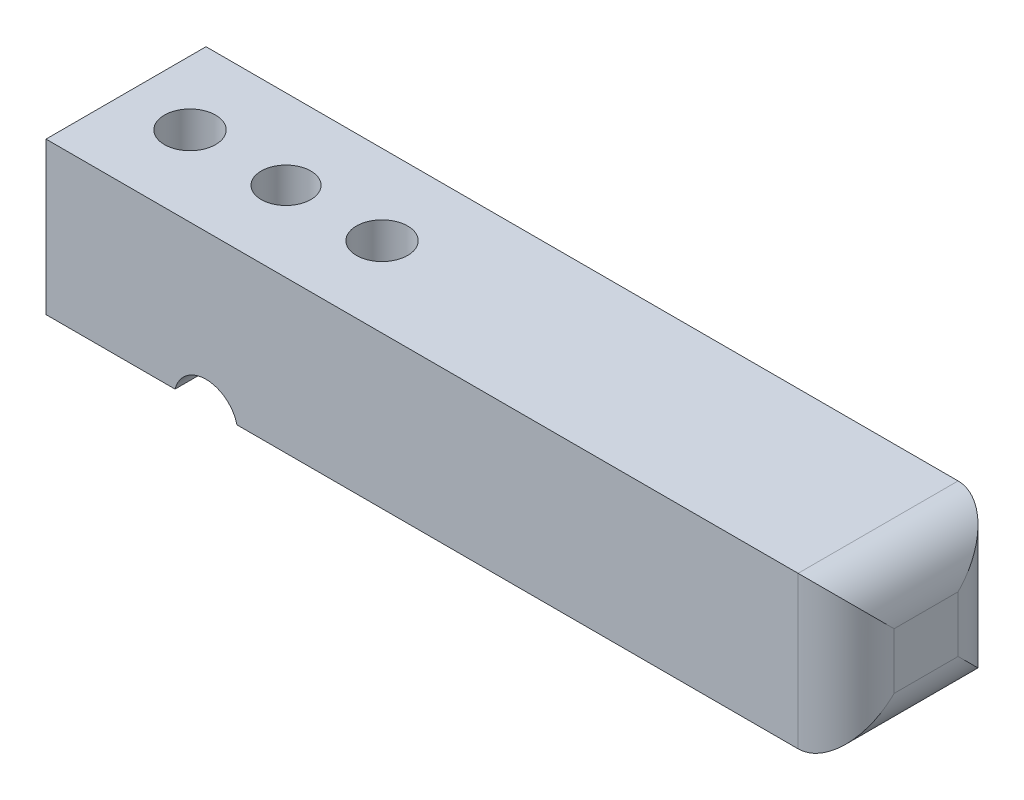
ISO-10303-21;
HEADER;
FILE_DESCRIPTION(('STEP AP214'),'2;1');
FILE_NAME('part.step','',(''),(''),'','','');
FILE_SCHEMA(('AUTOMOTIVE_DESIGN { 1 0 10303 214 1 1 1 1 }'));
ENDSEC;
DATA;
#1=APPLICATION_CONTEXT('core data for automotive mechanical design processes');
#2=APPLICATION_PROTOCOL_DEFINITION('international standard','automotive_design',2000,#1);
#3=PRODUCT_CONTEXT('',#1,'mechanical');
#4=PRODUCT('Part','Part','',(#3));
#5=PRODUCT_RELATED_PRODUCT_CATEGORY('part','',(#4));
#6=PRODUCT_DEFINITION_FORMATION('','',#4);
#7=PRODUCT_DEFINITION_CONTEXT('part definition',#1,'design');
#8=PRODUCT_DEFINITION('design','',#6,#7);
#9=PRODUCT_DEFINITION_SHAPE('','',#8);
#10=(LENGTH_UNIT() NAMED_UNIT(*) SI_UNIT(.MILLI.,.METRE.));
#11=(NAMED_UNIT(*) PLANE_ANGLE_UNIT() SI_UNIT($,.RADIAN.));
#12=(NAMED_UNIT(*) SI_UNIT($,.STERADIAN.) SOLID_ANGLE_UNIT());
#13=UNCERTAINTY_MEASURE_WITH_UNIT(LENGTH_MEASURE(1.E-05),#10,'distance_accuracy_value','');
#14=(GEOMETRIC_REPRESENTATION_CONTEXT(3) GLOBAL_UNCERTAINTY_ASSIGNED_CONTEXT((#13)) GLOBAL_UNIT_ASSIGNED_CONTEXT((#10,
#11,#12)) REPRESENTATION_CONTEXT('',''));
#15=CARTESIAN_POINT('',(0.,0.,0.));
#16=DIRECTION('',(0.,0.,1.));
#17=DIRECTION('',(1.,0.,0.));
#18=AXIS2_PLACEMENT_3D('',#15,#16,#17);
#19=CARTESIAN_POINT('',(0.,0.,10.));
#20=DIRECTION('',(0.,0.,-1.));
#21=DIRECTION('',(-1.,0.,0.));
#22=AXIS2_PLACEMENT_3D('',#19,#20,#21);
#23=CYLINDRICAL_SURFACE('',#22,2.);
#24=CARTESIAN_POINT('',(0.,2.,6.55));
#25=CARTESIAN_POINT('',(-0.0751536759924737,1.99999779760413,6.54999772768202));
#26=CARTESIAN_POINT('',(-0.150323982873093,1.99572691679677,6.54449810988736));
#27=CARTESIAN_POINT('',(-0.298199992054018,1.97904682033873,6.52288289983196));
#28=CARTESIAN_POINT('',(-0.37090395520125,1.96663198244478,6.50675997365466));
#29=CARTESIAN_POINT('',(-0.511418392934419,1.93484304159992,6.46502524295048));
#30=CARTESIAN_POINT('',(-0.579253451770658,1.91550736385041,6.43946580668986));
#31=CARTESIAN_POINT('',(-0.709202279732247,1.87129627902476,6.38008767384917));
#32=CARTESIAN_POINT('',(-0.771315363997565,1.84642021003683,6.34626799036881));
#33=CARTESIAN_POINT('',(-0.894694694530713,1.79012312670498,6.2680109041479));
#34=CARTESIAN_POINT('',(-0.955333341339268,1.75830681708261,6.22287455059775));
#35=CARTESIAN_POINT('',(-1.06865285187097,1.69183519595819,6.12520549732533));
#36=CARTESIAN_POINT('',(-1.12132238113412,1.65717594693956,6.07266246436559));
#37=CARTESIAN_POINT('',(-1.22897464440383,1.57953035369098,5.9488137658501));
#38=CARTESIAN_POINT('',(-1.2819930968487,1.536364561375,5.87590809165899));
#39=CARTESIAN_POINT('',(-1.37530471143981,1.45341275637492,5.7205781676354));
#40=CARTESIAN_POINT('',(-1.41561199089066,1.41362303032866,5.6381646174446));
#41=CARTESIAN_POINT('',(-1.47002795066326,1.35646033886457,5.49506494351921));
#42=CARTESIAN_POINT('',(-1.4883496130572,1.33616218096837,5.43716529019969));
#43=CARTESIAN_POINT('',(-1.51829517244874,1.30203552282385,5.31787589419606));
#44=CARTESIAN_POINT('',(-1.52993481059462,1.28819183207953,5.25649473136072));
#45=CARTESIAN_POINT('',(-1.54579323144967,1.26913046385795,5.13067086685359));
#46=CARTESIAN_POINT('',(-1.54992818718431,1.26401026565661,5.06620174014896));
#47=CARTESIAN_POINT('',(-1.55006990673508,1.26383700378979,4.93723596769177));
#48=CARTESIAN_POINT('',(-1.54607696275994,1.26878357821053,4.87273932301186));
#49=CARTESIAN_POINT('',(-1.53143160977061,1.28639696773229,4.7544259513841));
#50=CARTESIAN_POINT('',(-1.52171754907049,1.2979705438194,4.70031491943259));
#51=CARTESIAN_POINT('',(-1.49705955803457,1.32633598937714,4.59471360313749));
#52=CARTESIAN_POINT('',(-1.48210966620696,1.34313380468937,4.54322638312653));
#53=CARTESIAN_POINT('',(-1.43607426452343,1.39264188426146,4.41014157813249));
#54=CARTESIAN_POINT('',(-1.40085730908349,1.42852701365433,4.33116066139441));
#55=CARTESIAN_POINT('',(-1.31902100653082,1.50443429746572,4.18147184927585));
#56=CARTESIAN_POINT('',(-1.27237233814997,1.54446693497177,4.11078593042027));
#57=CARTESIAN_POINT('',(-1.16645539782076,1.62604170063465,3.97554547918557));
#58=CARTESIAN_POINT('',(-1.10680059862561,1.66758734444557,3.91129449324396));
#59=CARTESIAN_POINT('',(-0.97629957466434,1.74718844745096,3.79290635738495));
#60=CARTESIAN_POINT('',(-0.905473054362069,1.78524986868359,3.73875175986926));
#61=CARTESIAN_POINT('',(-0.766482875320224,1.84858773708474,3.65072856706321));
#62=CARTESIAN_POINT('',(-0.700012687883923,1.87493614938455,3.61496899421064));
#63=CARTESIAN_POINT('',(-0.560661412610429,1.92120673848397,3.55294682204902));
#64=CARTESIAN_POINT('',(-0.487783769237814,1.94113234144231,3.5266791585042));
#65=CARTESIAN_POINT('',(-0.336657866167162,1.97298265324959,3.48496072083245));
#66=CARTESIAN_POINT('',(-0.258373950104772,1.98484724870172,3.46959118109689));
#67=CARTESIAN_POINT('',(-0.0995316901465832,1.99910852116207,3.45113884490945));
#68=CARTESIAN_POINT('',(-0.0189749895806388,2.00151187091737,3.4480473890611));
#69=CARTESIAN_POINT('',(0.131583195738159,1.99691400584956,3.45398387133413));
#70=CARTESIAN_POINT('',(0.201681791904024,1.99101618619423,3.46158981244569));
#71=CARTESIAN_POINT('',(0.339284633951676,1.97223441483079,3.48597585961044));
#72=CARTESIAN_POINT('',(0.406788484270212,1.95934940242841,3.50275735856695));
#73=CARTESIAN_POINT('',(0.538365709859793,1.9273824183246,3.54483950777805));
#74=CARTESIAN_POINT('',(0.602392333539377,1.90823282130966,3.57023324096011));
#75=CARTESIAN_POINT('',(0.725171141364102,1.86503833542068,3.62841436737424));
#76=CARTESIAN_POINT('',(0.783922394155309,1.84099258458162,3.6612030625946));
#77=CARTESIAN_POINT('',(0.90447332466438,1.7852195772799,3.73890618520717));
#78=CARTESIAN_POINT('',(0.965277744575326,1.7528788767945,3.7849190889227));
#79=CARTESIAN_POINT('',(1.07876951358238,1.68541588021489,3.88444347940041));
#80=CARTESIAN_POINT('',(1.13144295625954,1.65028897080648,3.93796752050158));
#81=CARTESIAN_POINT('',(1.23861256374313,1.57197605255609,4.06376076259703));
#82=CARTESIAN_POINT('',(1.29116318642109,1.52864851644377,4.13760503756645));
#83=CARTESIAN_POINT('',(1.38333956093251,1.44574808149131,4.2949017126505));
#84=CARTESIAN_POINT('',(1.42298360038617,1.406169926986,4.37834028938247));
#85=CARTESIAN_POINT('',(1.47572537412509,1.35023532687271,4.52225188434806));
#86=CARTESIAN_POINT('',(1.49322213447881,1.33069594137269,4.57985835002319));
#87=CARTESIAN_POINT('',(1.52159153089938,1.29816285204411,4.69840858194056));
#88=CARTESIAN_POINT('',(1.53247993279712,1.28515358199035,4.75934402413404));
#89=CARTESIAN_POINT('',(1.54693721545875,1.26772524363723,4.88401864047516));
#90=CARTESIAN_POINT('',(1.55042885491277,1.26339685076968,4.94778037056076));
#91=CARTESIAN_POINT('',(1.54948622342283,1.26455222048878,5.07516537278516));
#92=CARTESIAN_POINT('',(1.54505060737967,1.27003764828777,5.138788619592));
#93=CARTESIAN_POINT('',(1.52970948772263,1.28844944320309,5.25605818319737));
#94=CARTESIAN_POINT('',(1.51964899950482,1.30039837928582,5.30998219183345));
#95=CARTESIAN_POINT('',(1.49434336712751,1.32940199648196,5.41517297762657));
#96=CARTESIAN_POINT('',(1.47909268933357,1.34646212467208,5.46643685111277));
#97=CARTESIAN_POINT('',(1.43204231479972,1.39681685136009,5.59966808638332));
#98=CARTESIAN_POINT('',(1.39602704839096,1.43328590207102,5.67894216496683));
#99=CARTESIAN_POINT('',(1.31244857045295,1.51020860863294,5.82908963861255));
#100=CARTESIAN_POINT('',(1.26485525650726,1.55067248520946,5.89994040673449));
#101=CARTESIAN_POINT('',(1.15692383769273,1.63287765781587,6.03525821974403));
#102=CARTESIAN_POINT('',(1.0962088679167,1.67461583203533,6.09942800819506));
#103=CARTESIAN_POINT('',(0.963444579945199,1.75435306725546,6.21742929196242));
#104=CARTESIAN_POINT('',(0.891415359723607,1.79235856781501,6.2712787501435));
#105=CARTESIAN_POINT('',(0.751025417422994,1.85491898331156,6.35791780499437));
#106=CARTESIAN_POINT('',(0.684467194211778,1.88066107606843,6.39276123986329));
#107=CARTESIAN_POINT('',(0.545140978222765,1.92565785300357,6.45294847541834));
#108=CARTESIAN_POINT('',(0.472380255459936,1.94492000482929,6.47830321493365));
#109=CARTESIAN_POINT('',(0.333400615652659,1.97309528922267,6.51516434047281));
#110=CARTESIAN_POINT('',(0.267803188477444,1.98311689281876,6.52816318516231));
#111=CARTESIAN_POINT('',(0.134808049666178,1.99656955117628,6.54558114257173));
#112=CARTESIAN_POINT('',(0.0674107150909819,2.00000197548661,6.55000203820476));
#113=CARTESIAN_POINT('',(0.,2.,6.55));
#114=B_SPLINE_CURVE_WITH_KNOTS('',3,(#24,#25,#26,#27,#28,#29,#30,#31,#32,#33,#34,#35,#36,#37,
#38,#39,#40,#41,#42,#43,#44,#45,#46,#47,#48,#49,#50,#51,#52,#53,#54,#55,#56,#57,#58,#59,#60,#61,
#62,#63,#64,#65,#66,#67,#68,#69,#70,#71,#72,#73,#74,#75,#76,#77,#78,#79,#80,#81,#82,#83,#84,#85,
#86,#87,#88,#89,#90,#91,#92,#93,#94,#95,#96,#97,#98,#99,#100,#101,#102,#103,#104,#105,#106,#107,
#108,#109,#110,#111,#112,#113),.UNSPECIFIED.,.T.,.F.,(4,2,2,2,2,2,2,2,2,2,2,2,2,2,2,2,2,2,2,2,2,
2,2,2,2,2,2,2,2,2,2,2,2,2,2,2,2,2,2,2,2,2,2,2,4),(0.,0.225181883608359,0.450519387090874,
0.674624721330886,0.89875684386133,1.14394244625269,1.38947356217851,1.68811842511844,
1.98643042885487,2.17792722300026,2.36897102844473,2.56213595150375,2.75529393015126,
2.92321250987939,3.09132290580978,3.37065947238806,3.65072015086896,3.94064246840192,
4.23005902978722,4.46895330734628,4.70771993835557,4.94824813637955,5.18860666629334,
5.39986464292888,5.61115469866806,5.82480532655742,6.03849360008622,6.28608532454966,
6.53409592245848,6.83425485575362,7.13398661729953,7.32327462496874,7.51210924690463,
7.7029062624513,7.89373565556959,8.06154510761747,8.22953403682791,8.51118123353462,
8.79356867722865,9.08551455704617,9.37694758671337,9.61426342125323,9.85130482257881,
10.0533285780904,10.2553103387843),.UNSPECIFIED.);
#115=CARTESIAN_POINT('',(0.,2.,6.55));
#116=VERTEX_POINT('',#115);
#117=EDGE_CURVE('E188',#116,#116,#114,.T.);
#118=ORIENTED_EDGE('',*,*,#117,.F.);
#119=EDGE_LOOP('',(#118));
#120=FACE_BOUND('',#119,.T.);
#121=CARTESIAN_POINT('',(0.,0.,0.));
#122=DIRECTION('',(0.,0.,1.));
#123=DIRECTION('',(1.,0.,0.));
#124=AXIS2_PLACEMENT_3D('',#121,#122,#123);
#125=CIRCLE('',#124,2.);
#126=CARTESIAN_POINT('',(1.93649167310371,0.5,0.));
#127=VERTEX_POINT('',#126);
#128=CARTESIAN_POINT('',(-1.93649167310371,0.5,0.));
#129=VERTEX_POINT('',#128);
#130=EDGE_CURVE('E113',#127,#129,#125,.T.);
#131=ORIENTED_EDGE('',*,*,#130,.F.);
#132=DIRECTION('',(0.,0.,-1.));
#133=VECTOR('',#132,1.);
#134=CARTESIAN_POINT('',(1.93649167310371,0.5,10.));
#135=LINE('',#134,#133);
#136=CARTESIAN_POINT('',(1.93649167310371,0.5,10.));
#137=VERTEX_POINT('',#136);
#138=EDGE_CURVE('E108',#137,#127,#135,.T.);
#139=ORIENTED_EDGE('',*,*,#138,.F.);
#140=CARTESIAN_POINT('',(0.,0.,10.));
#141=DIRECTION('',(0.,0.,1.));
#142=DIRECTION('',(1.,0.,0.));
#143=AXIS2_PLACEMENT_3D('',#140,#141,#142);
#144=CIRCLE('',#143,2.);
#145=CARTESIAN_POINT('',(-1.93649167310371,0.5,10.));
#146=VERTEX_POINT('',#145);
#147=EDGE_CURVE('E111',#137,#146,#144,.T.);
#148=ORIENTED_EDGE('',*,*,#147,.T.);
#149=DIRECTION('',(0.,0.,-1.));
#150=VECTOR('',#149,1.);
#151=CARTESIAN_POINT('',(-1.93649167310371,0.5,10.));
#152=LINE('',#151,#150);
#153=EDGE_CURVE('E146',#146,#129,#152,.T.);
#154=ORIENTED_EDGE('',*,*,#153,.T.);
#155=EDGE_LOOP('',(#131,#139,#148,#154));
#156=FACE_BOUND('',#155,.T.);
#157=ADVANCED_FACE('F40',(#120,#156),#23,.F.);
#158=CARTESIAN_POINT('',(0.,0.5,10.));
#159=DIRECTION('',(0.,1.,0.));
#160=DIRECTION('',(0.,0.,1.));
#161=AXIS2_PLACEMENT_3D('',#158,#159,#160);
#162=PLANE('',#161);
#163=CARTESIAN_POINT('',(6.,0.5,5.));
#164=DIRECTION('',(0.,1.,0.));
#165=DIRECTION('',(0.,0.,1.));
#166=AXIS2_PLACEMENT_3D('',#163,#164,#165);
#167=CIRCLE('',#166,1.6);
#168=CARTESIAN_POINT('',(6.,0.5,6.6));
#169=VERTEX_POINT('',#168);
#170=EDGE_CURVE('E138',#169,#169,#167,.T.);
#171=ORIENTED_EDGE('',*,*,#170,.T.);
#172=EDGE_LOOP('',(#171));
#173=FACE_BOUND('',#172,.T.);
#174=DIRECTION('',(1.,0.,0.));
#175=VECTOR('',#174,1.);
#176=CARTESIAN_POINT('',(0.,0.5,0.));
#177=LINE('',#176,#175);
#178=CARTESIAN_POINT('',(37.,0.5,0.));
#179=VERTEX_POINT('',#178);
#180=EDGE_CURVE('E148',#127,#179,#177,.T.);
#181=ORIENTED_EDGE('',*,*,#180,.T.);
#182=DIRECTION('',(0.,0.,-1.));
#183=VECTOR('',#182,1.);
#184=CARTESIAN_POINT('',(37.,0.5,10.));
#185=LINE('',#184,#183);
#186=CARTESIAN_POINT('',(37.,0.5,10.));
#187=VERTEX_POINT('',#186);
#188=EDGE_CURVE('E11',#179,#187,#185,.F.);
#189=ORIENTED_EDGE('',*,*,#188,.T.);
#190=DIRECTION('',(1.,0.,0.));
#191=VECTOR('',#190,1.);
#192=CARTESIAN_POINT('',(0.,0.5,10.));
#193=LINE('',#192,#191);
#194=EDGE_CURVE('E119',#137,#187,#193,.T.);
#195=ORIENTED_EDGE('',*,*,#194,.F.);
#196=ORIENTED_EDGE('',*,*,#138,.T.);
#197=EDGE_LOOP('',(#181,#189,#195,#196));
#198=FACE_BOUND('',#197,.T.);
#199=ADVANCED_FACE('F120',(#173,#198),#162,.F.);
#200=CARTESIAN_POINT('',(0.,10.,10.));
#201=DIRECTION('',(0.,1.,0.));
#202=DIRECTION('',(0.,0.,1.));
#203=AXIS2_PLACEMENT_3D('',#200,#201,#202);
#204=PLANE('',#203);
#205=CARTESIAN_POINT('',(0.,10.,5.));
#206=DIRECTION('',(0.,1.,0.));
#207=DIRECTION('',(0.,0.,1.));
#208=AXIS2_PLACEMENT_3D('',#205,#206,#207);
#209=CIRCLE('',#208,1.55);
#210=CARTESIAN_POINT('',(0.,10.,6.55));
#211=VERTEX_POINT('',#210);
#212=EDGE_CURVE('E183',#211,#211,#209,.T.);
#213=ORIENTED_EDGE('',*,*,#212,.F.);
#214=EDGE_LOOP('',(#213));
#215=FACE_BOUND('',#214,.T.);
#216=CARTESIAN_POINT('',(-6.,10.,5.));
#217=DIRECTION('',(0.,1.,0.));
#218=DIRECTION('',(0.,0.,1.));
#219=AXIS2_PLACEMENT_3D('',#216,#217,#218);
#220=CIRCLE('',#219,1.6);
#221=CARTESIAN_POINT('',(-6.,10.,6.6));
#222=VERTEX_POINT('',#221);
#223=EDGE_CURVE('E161',#222,#222,#220,.T.);
#224=ORIENTED_EDGE('',*,*,#223,.F.);
#225=EDGE_LOOP('',(#224));
#226=FACE_BOUND('',#225,.T.);
#227=CARTESIAN_POINT('',(6.,10.,5.));
#228=DIRECTION('',(0.,1.,0.));
#229=DIRECTION('',(0.,0.,1.));
#230=AXIS2_PLACEMENT_3D('',#227,#228,#229);
#231=CIRCLE('',#230,1.6);
#232=CARTESIAN_POINT('',(6.,10.,6.6));
#233=VERTEX_POINT('',#232);
#234=EDGE_CURVE('E193',#233,#233,#231,.T.);
#235=ORIENTED_EDGE('',*,*,#234,.F.);
#236=EDGE_LOOP('',(#235));
#237=FACE_BOUND('',#236,.T.);
#238=DIRECTION('',(1.,0.,0.));
#239=VECTOR('',#238,1.);
#240=CARTESIAN_POINT('',(0.,10.,10.));
#241=LINE('',#240,#239);
#242=CARTESIAN_POINT('',(-10.,10.,10.));
#243=VERTEX_POINT('',#242);
#244=CARTESIAN_POINT('',(37.,10.,10.));
#245=VERTEX_POINT('',#244);
#246=EDGE_CURVE('E125',#243,#245,#241,.T.);
#247=ORIENTED_EDGE('',*,*,#246,.T.);
#248=DIRECTION('',(0.,0.,1.));
#249=VECTOR('',#248,1.);
#250=CARTESIAN_POINT('',(37.,10.,10.));
#251=LINE('',#250,#249);
#252=CARTESIAN_POINT('',(37.,10.,0.));
#253=VERTEX_POINT('',#252);
#254=EDGE_CURVE('E64',#245,#253,#251,.F.);
#255=ORIENTED_EDGE('',*,*,#254,.T.);
#256=DIRECTION('',(1.,0.,0.));
#257=VECTOR('',#256,1.);
#258=CARTESIAN_POINT('',(0.,10.,0.));
#259=LINE('',#258,#257);
#260=CARTESIAN_POINT('',(-10.,10.,0.));
#261=VERTEX_POINT('',#260);
#262=EDGE_CURVE('E150',#261,#253,#259,.T.);
#263=ORIENTED_EDGE('',*,*,#262,.F.);
#264=DIRECTION('',(0.,0.,-1.));
#265=VECTOR('',#264,1.);
#266=CARTESIAN_POINT('',(-10.,10.,10.));
#267=LINE('',#266,#265);
#268=EDGE_CURVE('E116',#243,#261,#267,.T.);
#269=ORIENTED_EDGE('',*,*,#268,.F.);
#270=EDGE_LOOP('',(#247,#255,#263,#269));
#271=FACE_BOUND('',#270,.T.);
#272=ADVANCED_FACE('F231',(#215,#226,#237,#271),#204,.T.);
#273=CARTESIAN_POINT('',(-10.,0.,10.));
#274=DIRECTION('',(-1.,0.,0.));
#275=DIRECTION('',(0.,0.,1.));
#276=AXIS2_PLACEMENT_3D('',#273,#274,#275);
#277=PLANE('',#276);
#278=DIRECTION('',(0.,1.,0.));
#279=VECTOR('',#278,1.);
#280=CARTESIAN_POINT('',(-10.,0.,0.));
#281=LINE('',#280,#279);
#282=CARTESIAN_POINT('',(-10.,0.5,0.));
#283=VERTEX_POINT('',#282);
#284=EDGE_CURVE('E135',#283,#261,#281,.T.);
#285=ORIENTED_EDGE('',*,*,#284,.F.);
#286=DIRECTION('',(0.,0.,-1.));
#287=VECTOR('',#286,1.);
#288=CARTESIAN_POINT('',(-10.,0.5,10.));
#289=LINE('',#288,#287);
#290=CARTESIAN_POINT('',(-10.,0.5,10.));
#291=VERTEX_POINT('',#290);
#292=EDGE_CURVE('E155',#291,#283,#289,.T.);
#293=ORIENTED_EDGE('',*,*,#292,.F.);
#294=DIRECTION('',(0.,1.,0.));
#295=VECTOR('',#294,1.);
#296=CARTESIAN_POINT('',(-10.,0.,10.));
#297=LINE('',#296,#295);
#298=EDGE_CURVE('E142',#291,#243,#297,.T.);
#299=ORIENTED_EDGE('',*,*,#298,.T.);
#300=ORIENTED_EDGE('',*,*,#268,.T.);
#301=EDGE_LOOP('',(#285,#293,#299,#300));
#302=FACE_BOUND('',#301,.T.);
#303=ADVANCED_FACE('F227',(#302),#277,.T.);
#304=CARTESIAN_POINT('',(0.,0.5,10.));
#305=DIRECTION('',(0.,1.,0.));
#306=DIRECTION('',(0.,0.,1.));
#307=AXIS2_PLACEMENT_3D('',#304,#305,#306);
#308=PLANE('',#307);
#309=CARTESIAN_POINT('',(-6.,0.5,5.));
#310=DIRECTION('',(0.,1.,0.));
#311=DIRECTION('',(0.,0.,1.));
#312=AXIS2_PLACEMENT_3D('',#309,#310,#311);
#313=CIRCLE('',#312,1.6);
#314=CARTESIAN_POINT('',(-6.,0.5,6.6));
#315=VERTEX_POINT('',#314);
#316=EDGE_CURVE('E158',#315,#315,#313,.T.);
#317=ORIENTED_EDGE('',*,*,#316,.T.);
#318=EDGE_LOOP('',(#317));
#319=FACE_BOUND('',#318,.T.);
#320=DIRECTION('',(1.,0.,0.));
#321=VECTOR('',#320,1.);
#322=CARTESIAN_POINT('',(0.,0.5,0.));
#323=LINE('',#322,#321);
#324=EDGE_CURVE('E132',#283,#129,#323,.T.);
#325=ORIENTED_EDGE('',*,*,#324,.T.);
#326=ORIENTED_EDGE('',*,*,#153,.F.);
#327=DIRECTION('',(1.,0.,0.));
#328=VECTOR('',#327,1.);
#329=CARTESIAN_POINT('',(0.,0.5,10.));
#330=LINE('',#329,#328);
#331=EDGE_CURVE('E130',#291,#146,#330,.T.);
#332=ORIENTED_EDGE('',*,*,#331,.F.);
#333=ORIENTED_EDGE('',*,*,#292,.T.);
#334=EDGE_LOOP('',(#325,#326,#332,#333));
#335=FACE_BOUND('',#334,.T.);
#336=ADVANCED_FACE('F222',(#319,#335),#308,.F.);
#337=CARTESIAN_POINT('',(0.,0.,10.));
#338=DIRECTION('',(0.,0.,1.));
#339=DIRECTION('',(1.,0.,0.));
#340=AXIS2_PLACEMENT_3D('',#337,#338,#339);
#341=PLANE('',#340);
#342=ORIENTED_EDGE('',*,*,#194,.T.);
#343=DIRECTION('',(0.,-1.,0.));
#344=VECTOR('',#343,1.);
#345=CARTESIAN_POINT('',(37.,0.,10.));
#346=LINE('',#345,#344);
#347=EDGE_CURVE('E170',#187,#245,#346,.F.);
#348=ORIENTED_EDGE('',*,*,#347,.T.);
#349=ORIENTED_EDGE('',*,*,#246,.F.);
#350=ORIENTED_EDGE('',*,*,#298,.F.);
#351=ORIENTED_EDGE('',*,*,#331,.T.);
#352=ORIENTED_EDGE('',*,*,#147,.F.);
#353=EDGE_LOOP('',(#342,#348,#349,#350,#351,#352));
#354=FACE_BOUND('',#353,.T.);
#355=ADVANCED_FACE('F127',(#354),#341,.T.);
#356=CARTESIAN_POINT('',(0.,0.,0.));
#357=DIRECTION('',(0.,0.,1.));
#358=DIRECTION('',(1.,0.,0.));
#359=AXIS2_PLACEMENT_3D('',#356,#357,#358);
#360=PLANE('',#359);
#361=ORIENTED_EDGE('',*,*,#262,.T.);
#362=DIRECTION('',(0.,1.,0.));
#363=VECTOR('',#362,1.);
#364=CARTESIAN_POINT('',(37.,0.499999999999997,0.));
#365=LINE('',#364,#363);
#366=EDGE_CURVE('E49',#253,#179,#365,.F.);
#367=ORIENTED_EDGE('',*,*,#366,.T.);
#368=ORIENTED_EDGE('',*,*,#180,.F.);
#369=ORIENTED_EDGE('',*,*,#130,.T.);
#370=ORIENTED_EDGE('',*,*,#324,.F.);
#371=ORIENTED_EDGE('',*,*,#284,.T.);
#372=EDGE_LOOP('',(#361,#367,#368,#369,#370,#371));
#373=FACE_BOUND('',#372,.T.);
#374=ADVANCED_FACE('F215',(#373),#360,.F.);
#375=CARTESIAN_POINT('',(-6.,-10.,5.));
#376=DIRECTION('',(0.,1.,0.));
#377=DIRECTION('',(0.,0.,1.));
#378=AXIS2_PLACEMENT_3D('',#375,#376,#377);
#379=CYLINDRICAL_SURFACE('',#378,1.6);
#380=ORIENTED_EDGE('',*,*,#223,.T.);
#381=EDGE_LOOP('',(#380));
#382=FACE_BOUND('',#381,.T.);
#383=ORIENTED_EDGE('',*,*,#316,.F.);
#384=EDGE_LOOP('',(#383));
#385=FACE_BOUND('',#384,.T.);
#386=ADVANCED_FACE('F212',(#382,#385),#379,.F.);
#387=CARTESIAN_POINT('',(6.,-10.,5.));
#388=DIRECTION('',(0.,1.,0.));
#389=DIRECTION('',(0.,0.,1.));
#390=AXIS2_PLACEMENT_3D('',#387,#388,#389);
#391=CYLINDRICAL_SURFACE('',#390,1.6);
#392=ORIENTED_EDGE('',*,*,#234,.T.);
#393=EDGE_LOOP('',(#392));
#394=FACE_BOUND('',#393,.T.);
#395=ORIENTED_EDGE('',*,*,#170,.F.);
#396=EDGE_LOOP('',(#395));
#397=FACE_BOUND('',#396,.T.);
#398=ADVANCED_FACE('F210',(#394,#397),#391,.F.);
#399=CARTESIAN_POINT('',(0.,0.,5.));
#400=DIRECTION('',(0.,1.,0.));
#401=DIRECTION('',(0.,0.,1.));
#402=AXIS2_PLACEMENT_3D('',#399,#400,#401);
#403=CYLINDRICAL_SURFACE('',#402,1.55);
#404=ORIENTED_EDGE('',*,*,#117,.T.);
#405=EDGE_LOOP('',(#404));
#406=FACE_BOUND('',#405,.T.);
#407=ORIENTED_EDGE('',*,*,#212,.T.);
#408=EDGE_LOOP('',(#407));
#409=FACE_BOUND('',#408,.T.);
#410=ADVANCED_FACE('F204',(#406,#409),#403,.F.);
#411=CARTESIAN_POINT('',(40.,0.,0.));
#412=DIRECTION('',(1.,0.,0.));
#413=DIRECTION('',(0.,0.,-1.));
#414=AXIS2_PLACEMENT_3D('',#411,#412,#413);
#415=PLANE('',#414);
#416=DIRECTION('',(0.,0.,1.));
#417=VECTOR('',#416,1.);
#418=CARTESIAN_POINT('',(40.,7.,0.));
#419=LINE('',#418,#417);
#420=CARTESIAN_POINT('',(40.,7.,3.));
#421=VERTEX_POINT('',#420);
#422=CARTESIAN_POINT('',(40.,7.,7.));
#423=VERTEX_POINT('',#422);
#424=EDGE_CURVE('E165',#421,#423,#419,.T.);
#425=ORIENTED_EDGE('',*,*,#424,.T.);
#426=DIRECTION('',(0.,-1.,0.));
#427=VECTOR('',#426,1.);
#428=CARTESIAN_POINT('',(40.,0.,7.));
#429=LINE('',#428,#427);
#430=CARTESIAN_POINT('',(40.,3.5,7.));
#431=VERTEX_POINT('',#430);
#432=EDGE_CURVE('E167',#423,#431,#429,.T.);
#433=ORIENTED_EDGE('',*,*,#432,.T.);
#434=DIRECTION('',(0.,0.,-1.));
#435=VECTOR('',#434,1.);
#436=CARTESIAN_POINT('',(40.,3.5,0.));
#437=LINE('',#436,#435);
#438=CARTESIAN_POINT('',(40.,3.5,3.));
#439=VERTEX_POINT('',#438);
#440=EDGE_CURVE('E115',#431,#439,#437,.T.);
#441=ORIENTED_EDGE('',*,*,#440,.T.);
#442=DIRECTION('',(0.,1.,0.));
#443=VECTOR('',#442,1.);
#444=CARTESIAN_POINT('',(40.,10.,3.));
#445=LINE('',#444,#443);
#446=EDGE_CURVE('E163',#439,#421,#445,.T.);
#447=ORIENTED_EDGE('',*,*,#446,.T.);
#448=EDGE_LOOP('',(#425,#433,#441,#447));
#449=FACE_BOUND('',#448,.T.);
#450=ADVANCED_FACE('F209',(#449),#415,.T.);
#451=CARTESIAN_POINT('',(37.,0.,3.));
#452=DIRECTION('',(0.,-1.,0.));
#453=DIRECTION('',(0.,0.,-1.));
#454=AXIS2_PLACEMENT_3D('',#451,#452,#453);
#455=CYLINDRICAL_SURFACE('',#454,3.);
#456=CARTESIAN_POINT('',(37.,3.5,3.));
#457=DIRECTION('',(0.,-0.707106781186547,0.707106781186547));
#458=DIRECTION('',(0.,0.707106781186547,0.707106781186547));
#459=AXIS2_PLACEMENT_3D('',#456,#457,#458);
#460=ELLIPSE('',#459,4.24264068711928,3.);
#461=EDGE_CURVE('E177',#179,#439,#460,.T.);
#462=ORIENTED_EDGE('',*,*,#461,.F.);
#463=ORIENTED_EDGE('',*,*,#366,.F.);
#464=CARTESIAN_POINT('',(37.,7.,3.));
#465=DIRECTION('',(0.,-0.707106781186547,-0.707106781186547));
#466=DIRECTION('',(0.,-0.707106781186547,0.707106781186547));
#467=AXIS2_PLACEMENT_3D('',#464,#465,#466);
#468=ELLIPSE('',#467,4.24264068711928,3.);
#469=EDGE_CURVE('E44',#421,#253,#468,.F.);
#470=ORIENTED_EDGE('',*,*,#469,.F.);
#471=ORIENTED_EDGE('',*,*,#446,.F.);
#472=EDGE_LOOP('',(#462,#463,#470,#471));
#473=FACE_BOUND('',#472,.T.);
#474=ADVANCED_FACE('F42',(#473),#455,.T.);
#475=CARTESIAN_POINT('',(37.,7.,0.));
#476=DIRECTION('',(0.,0.,1.));
#477=DIRECTION('',(1.,0.,0.));
#478=AXIS2_PLACEMENT_3D('',#475,#476,#477);
#479=CYLINDRICAL_SURFACE('',#478,3.);
#480=ORIENTED_EDGE('',*,*,#469,.T.);
#481=ORIENTED_EDGE('',*,*,#254,.F.);
#482=CARTESIAN_POINT('',(37.,7.,7.));
#483=DIRECTION('',(0.,-0.707106781186547,0.707106781186547));
#484=DIRECTION('',(0.,0.707106781186547,0.707106781186547));
#485=AXIS2_PLACEMENT_3D('',#482,#483,#484);
#486=ELLIPSE('',#485,4.24264068711928,3.);
#487=EDGE_CURVE('E176',#423,#245,#486,.T.);
#488=ORIENTED_EDGE('',*,*,#487,.F.);
#489=ORIENTED_EDGE('',*,*,#424,.F.);
#490=EDGE_LOOP('',(#480,#481,#488,#489));
#491=FACE_BOUND('',#490,.T.);
#492=ADVANCED_FACE('F329',(#491),#479,.T.);
#493=CARTESIAN_POINT('',(37.,3.5,0.));
#494=DIRECTION('',(0.,0.,1.));
#495=DIRECTION('',(1.,0.,0.));
#496=AXIS2_PLACEMENT_3D('',#493,#494,#495);
#497=CYLINDRICAL_SURFACE('',#496,3.);
#498=ORIENTED_EDGE('',*,*,#461,.T.);
#499=ORIENTED_EDGE('',*,*,#440,.F.);
#500=CARTESIAN_POINT('',(37.,3.5,7.));
#501=DIRECTION('',(0.,0.707106781186547,0.707106781186547));
#502=DIRECTION('',(0.,-0.707106781186547,0.707106781186547));
#503=AXIS2_PLACEMENT_3D('',#500,#501,#502);
#504=ELLIPSE('',#503,4.24264068711928,3.);
#505=EDGE_CURVE('E174',#187,#431,#504,.T.);
#506=ORIENTED_EDGE('',*,*,#505,.F.);
#507=ORIENTED_EDGE('',*,*,#188,.F.);
#508=EDGE_LOOP('',(#498,#499,#506,#507));
#509=FACE_BOUND('',#508,.T.);
#510=ADVANCED_FACE('F338',(#509),#497,.T.);
#511=CARTESIAN_POINT('',(37.,0.,7.));
#512=DIRECTION('',(0.,-1.,0.));
#513=DIRECTION('',(0.,0.,-1.));
#514=AXIS2_PLACEMENT_3D('',#511,#512,#513);
#515=CYLINDRICAL_SURFACE('',#514,3.);
#516=ORIENTED_EDGE('',*,*,#487,.T.);
#517=ORIENTED_EDGE('',*,*,#347,.F.);
#518=ORIENTED_EDGE('',*,*,#505,.T.);
#519=ORIENTED_EDGE('',*,*,#432,.F.);
#520=EDGE_LOOP('',(#516,#517,#518,#519));
#521=FACE_BOUND('',#520,.T.);
#522=ADVANCED_FACE('F346',(#521),#515,.T.);
#523=CLOSED_SHELL('',(#157,#199,#272,#303,#336,#355,#374,#386,#398,#410,#450,#474,#492,#510,#522));
#524=MANIFOLD_SOLID_BREP('B2',#523);
#525=ADVANCED_BREP_SHAPE_REPRESENTATION('',(#18,#524),#14);
#526=SHAPE_DEFINITION_REPRESENTATION(#9,#525);
ENDSEC;
END-ISO-10303-21;
